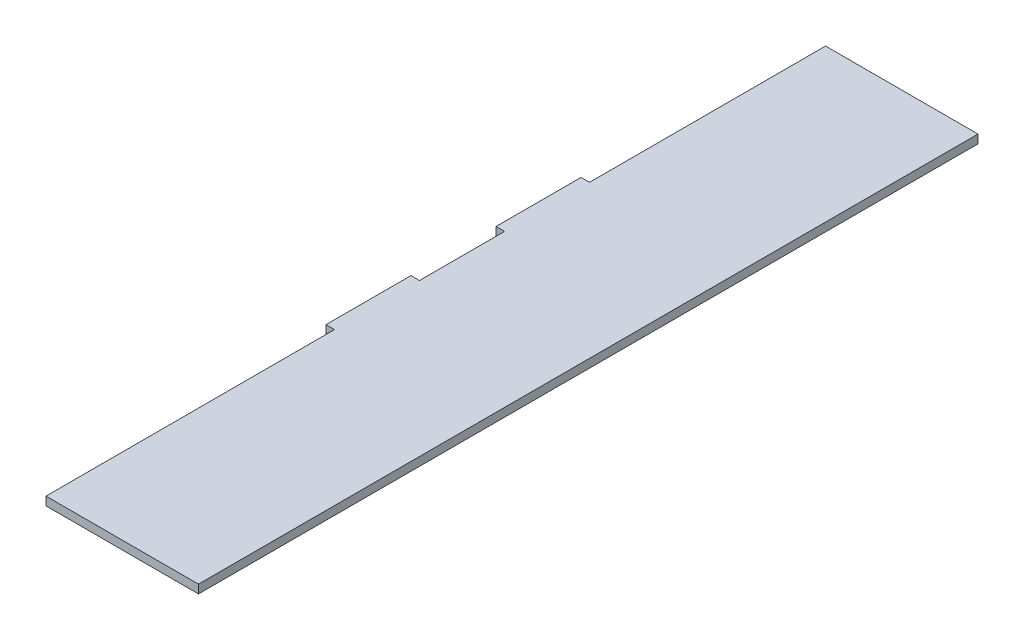
ISO-10303-21;
HEADER;
FILE_DESCRIPTION(('STEP AP214'),'2;1');
FILE_NAME('part.step','',(''),(''),'','','');
FILE_SCHEMA(('AUTOMOTIVE_DESIGN { 1 0 10303 214 1 1 1 1 }'));
ENDSEC;
DATA;
#1=APPLICATION_CONTEXT('core data for automotive mechanical design processes');
#2=APPLICATION_PROTOCOL_DEFINITION('international standard','automotive_design',2000,#1);
#3=PRODUCT_CONTEXT('',#1,'mechanical');
#4=PRODUCT('Part','Part','',(#3));
#5=PRODUCT_RELATED_PRODUCT_CATEGORY('part','',(#4));
#6=PRODUCT_DEFINITION_FORMATION('','',#4);
#7=PRODUCT_DEFINITION_CONTEXT('part definition',#1,'design');
#8=PRODUCT_DEFINITION('design','',#6,#7);
#9=PRODUCT_DEFINITION_SHAPE('','',#8);
#10=(LENGTH_UNIT() NAMED_UNIT(*) SI_UNIT(.MILLI.,.METRE.));
#11=(NAMED_UNIT(*) PLANE_ANGLE_UNIT() SI_UNIT($,.RADIAN.));
#12=(NAMED_UNIT(*) SI_UNIT($,.STERADIAN.) SOLID_ANGLE_UNIT());
#13=UNCERTAINTY_MEASURE_WITH_UNIT(LENGTH_MEASURE(1.E-05),#10,'distance_accuracy_value','');
#14=(GEOMETRIC_REPRESENTATION_CONTEXT(3) GLOBAL_UNCERTAINTY_ASSIGNED_CONTEXT((#13)) GLOBAL_UNIT_ASSIGNED_CONTEXT((#10,
#11,#12)) REPRESENTATION_CONTEXT('',''));
#15=CARTESIAN_POINT('',(0.,0.,0.));
#16=DIRECTION('',(0.,0.,1.));
#17=DIRECTION('',(1.,0.,0.));
#18=AXIS2_PLACEMENT_3D('',#15,#16,#17);
#19=CARTESIAN_POINT('',(0.,3.,0.));
#20=DIRECTION('',(1.,0.,0.));
#21=DIRECTION('',(0.,0.,-1.));
#22=AXIS2_PLACEMENT_3D('',#19,#20,#21);
#23=PLANE('',#22);
#24=DIRECTION('',(0.,0.,1.));
#25=VECTOR('',#24,1.);
#26=CARTESIAN_POINT('',(0.,3.,0.));
#27=LINE('',#26,#25);
#28=CARTESIAN_POINT('',(0.,3.,-191.8));
#29=VERTEX_POINT('',#28);
#30=CARTESIAN_POINT('',(0.,3.,-161.8));
#31=VERTEX_POINT('',#30);
#32=EDGE_CURVE('E136',#29,#31,#27,.T.);
#33=ORIENTED_EDGE('',*,*,#32,.F.);
#34=DIRECTION('',(0.,1.,0.));
#35=VECTOR('',#34,1.);
#36=CARTESIAN_POINT('',(0.,-2.,-191.8));
#37=LINE('',#36,#35);
#38=CARTESIAN_POINT('',(0.,0.,-191.8));
#39=VERTEX_POINT('',#38);
#40=EDGE_CURVE('E119',#39,#29,#37,.T.);
#41=ORIENTED_EDGE('',*,*,#40,.F.);
#42=DIRECTION('',(0.,0.,1.));
#43=VECTOR('',#42,1.);
#44=CARTESIAN_POINT('',(0.,0.,0.));
#45=LINE('',#44,#43);
#46=CARTESIAN_POINT('',(0.,0.,-161.8));
#47=VERTEX_POINT('',#46);
#48=EDGE_CURVE('E159',#39,#47,#45,.T.);
#49=ORIENTED_EDGE('',*,*,#48,.T.);
#50=DIRECTION('',(0.,1.,0.));
#51=VECTOR('',#50,1.);
#52=CARTESIAN_POINT('',(0.,-2.,-161.8));
#53=LINE('',#52,#51);
#54=EDGE_CURVE('E140',#47,#31,#53,.T.);
#55=ORIENTED_EDGE('',*,*,#54,.T.);
#56=EDGE_LOOP('',(#33,#41,#49,#55));
#57=FACE_BOUND('',#56,.T.);
#58=ADVANCED_FACE('F33',(#57),#23,.F.);
#59=CARTESIAN_POINT('',(0.,0.,-131.8));
#60=VERTEX_POINT('',#59);
#61=CARTESIAN_POINT('',(0.,0.,-101.8));
#62=VERTEX_POINT('',#61);
#63=EDGE_CURVE('E156',#60,#62,#45,.T.);
#64=ORIENTED_EDGE('',*,*,#63,.T.);
#65=DIRECTION('',(0.,1.,0.));
#66=VECTOR('',#65,1.);
#67=CARTESIAN_POINT('',(0.,-2.,-101.8));
#68=LINE('',#67,#66);
#69=CARTESIAN_POINT('',(0.,3.,-101.8));
#70=VERTEX_POINT('',#69);
#71=EDGE_CURVE('E137',#62,#70,#68,.T.);
#72=ORIENTED_EDGE('',*,*,#71,.T.);
#73=CARTESIAN_POINT('',(0.,3.,-131.8));
#74=VERTEX_POINT('',#73);
#75=EDGE_CURVE('E142',#74,#70,#27,.T.);
#76=ORIENTED_EDGE('',*,*,#75,.F.);
#77=DIRECTION('',(0.,1.,0.));
#78=VECTOR('',#77,1.);
#79=CARTESIAN_POINT('',(0.,-2.,-131.8));
#80=LINE('',#79,#78);
#81=EDGE_CURVE('E149',#60,#74,#80,.T.);
#82=ORIENTED_EDGE('',*,*,#81,.F.);
#83=EDGE_LOOP('',(#64,#72,#76,#82));
#84=FACE_BOUND('',#83,.T.);
#85=ADVANCED_FACE('F35',(#84),#23,.F.);
#86=CARTESIAN_POINT('',(0.,3.,0.));
#87=DIRECTION('',(0.,0.,-1.));
#88=DIRECTION('',(-1.,0.,0.));
#89=AXIS2_PLACEMENT_3D('',#86,#87,#88);
#90=PLANE('',#89);
#91=DIRECTION('',(1.,0.,0.));
#92=VECTOR('',#91,1.);
#93=CARTESIAN_POINT('',(0.,3.,0.));
#94=LINE('',#93,#92);
#95=CARTESIAN_POINT('',(3.,3.,0.));
#96=VERTEX_POINT('',#95);
#97=CARTESIAN_POINT('',(56.8,3.,0.));
#98=VERTEX_POINT('',#97);
#99=EDGE_CURVE('E141',#96,#98,#94,.T.);
#100=ORIENTED_EDGE('',*,*,#99,.F.);
#101=DIRECTION('',(0.,1.,0.));
#102=VECTOR('',#101,1.);
#103=CARTESIAN_POINT('',(3.,-2.,0.));
#104=LINE('',#103,#102);
#105=CARTESIAN_POINT('',(3.,0.,0.));
#106=VERTEX_POINT('',#105);
#107=EDGE_CURVE('E195',#106,#96,#104,.T.);
#108=ORIENTED_EDGE('',*,*,#107,.F.);
#109=DIRECTION('',(1.,0.,0.));
#110=VECTOR('',#109,1.);
#111=CARTESIAN_POINT('',(0.,0.,0.));
#112=LINE('',#111,#110);
#113=CARTESIAN_POINT('',(56.8,0.,0.));
#114=VERTEX_POINT('',#113);
#115=EDGE_CURVE('E161',#106,#114,#112,.T.);
#116=ORIENTED_EDGE('',*,*,#115,.T.);
#117=DIRECTION('',(0.,-1.,0.));
#118=VECTOR('',#117,1.);
#119=CARTESIAN_POINT('',(56.8,3.,0.));
#120=LINE('',#119,#118);
#121=EDGE_CURVE('E169',#98,#114,#120,.T.);
#122=ORIENTED_EDGE('',*,*,#121,.F.);
#123=EDGE_LOOP('',(#100,#108,#116,#122));
#124=FACE_BOUND('',#123,.T.);
#125=ADVANCED_FACE('F199',(#124),#90,.F.);
#126=CARTESIAN_POINT('',(56.8,3.,0.));
#127=DIRECTION('',(-1.,0.,0.));
#128=DIRECTION('',(0.,0.,1.));
#129=AXIS2_PLACEMENT_3D('',#126,#127,#128);
#130=PLANE('',#129);
#131=DIRECTION('',(0.,0.,-1.));
#132=VECTOR('',#131,1.);
#133=CARTESIAN_POINT('',(56.8,0.,0.));
#134=LINE('',#133,#132);
#135=CARTESIAN_POINT('',(56.8,0.,-275.1));
#136=VERTEX_POINT('',#135);
#137=EDGE_CURVE('E163',#114,#136,#134,.T.);
#138=ORIENTED_EDGE('',*,*,#137,.T.);
#139=DIRECTION('',(0.,-1.,0.));
#140=VECTOR('',#139,1.);
#141=CARTESIAN_POINT('',(56.8,3.,-275.1));
#142=LINE('',#141,#140);
#143=CARTESIAN_POINT('',(56.8,3.,-275.1));
#144=VERTEX_POINT('',#143);
#145=EDGE_CURVE('E155',#144,#136,#142,.T.);
#146=ORIENTED_EDGE('',*,*,#145,.F.);
#147=DIRECTION('',(0.,0.,-1.));
#148=VECTOR('',#147,1.);
#149=CARTESIAN_POINT('',(56.8,3.,0.));
#150=LINE('',#149,#148);
#151=EDGE_CURVE('E144',#98,#144,#150,.T.);
#152=ORIENTED_EDGE('',*,*,#151,.F.);
#153=ORIENTED_EDGE('',*,*,#121,.T.);
#154=EDGE_LOOP('',(#138,#146,#152,#153));
#155=FACE_BOUND('',#154,.T.);
#156=ADVANCED_FACE('F243',(#155),#130,.F.);
#157=CARTESIAN_POINT('',(0.,3.,-275.1));
#158=DIRECTION('',(0.,0.,1.));
#159=DIRECTION('',(1.,0.,0.));
#160=AXIS2_PLACEMENT_3D('',#157,#158,#159);
#161=PLANE('',#160);
#162=DIRECTION('',(-1.,0.,0.));
#163=VECTOR('',#162,1.);
#164=CARTESIAN_POINT('',(0.,0.,-275.1));
#165=LINE('',#164,#163);
#166=CARTESIAN_POINT('',(3.,0.,-275.1));
#167=VERTEX_POINT('',#166);
#168=EDGE_CURVE('E147',#136,#167,#165,.T.);
#169=ORIENTED_EDGE('',*,*,#168,.T.);
#170=DIRECTION('',(0.,1.,0.));
#171=VECTOR('',#170,1.);
#172=CARTESIAN_POINT('',(3.,-2.,-275.1));
#173=LINE('',#172,#171);
#174=CARTESIAN_POINT('',(3.,3.,-275.1));
#175=VERTEX_POINT('',#174);
#176=EDGE_CURVE('E160',#167,#175,#173,.T.);
#177=ORIENTED_EDGE('',*,*,#176,.T.);
#178=DIRECTION('',(-1.,0.,0.));
#179=VECTOR('',#178,1.);
#180=CARTESIAN_POINT('',(0.,3.,-275.1));
#181=LINE('',#180,#179);
#182=EDGE_CURVE('E153',#144,#175,#181,.T.);
#183=ORIENTED_EDGE('',*,*,#182,.F.);
#184=ORIENTED_EDGE('',*,*,#145,.T.);
#185=EDGE_LOOP('',(#169,#177,#183,#184));
#186=FACE_BOUND('',#185,.T.);
#187=ADVANCED_FACE('F238',(#186),#161,.F.);
#188=CARTESIAN_POINT('',(0.,3.,0.));
#189=DIRECTION('',(0.,-1.,0.));
#190=DIRECTION('',(0.,0.,-1.));
#191=AXIS2_PLACEMENT_3D('',#188,#189,#190);
#192=PLANE('',#191);
#193=ORIENTED_EDGE('',*,*,#182,.T.);
#194=DIRECTION('',(0.,0.,-1.));
#195=VECTOR('',#194,1.);
#196=CARTESIAN_POINT('',(3.,3.,-275.1));
#197=LINE('',#196,#195);
#198=CARTESIAN_POINT('',(3.00000000000001,3.,-191.8));
#199=VERTEX_POINT('',#198);
#200=EDGE_CURVE('E129',#199,#175,#197,.T.);
#201=ORIENTED_EDGE('',*,*,#200,.F.);
#202=DIRECTION('',(1.,0.,0.));
#203=VECTOR('',#202,1.);
#204=CARTESIAN_POINT('',(0.,3.,-191.8));
#205=LINE('',#204,#203);
#206=EDGE_CURVE('E122',#29,#199,#205,.T.);
#207=ORIENTED_EDGE('',*,*,#206,.F.);
#208=ORIENTED_EDGE('',*,*,#32,.T.);
#209=DIRECTION('',(-1.,0.,0.));
#210=VECTOR('',#209,1.);
#211=CARTESIAN_POINT('',(0.,3.,-161.8));
#212=LINE('',#211,#210);
#213=CARTESIAN_POINT('',(3.00000000000001,3.,-161.8));
#214=VERTEX_POINT('',#213);
#215=EDGE_CURVE('E214',#214,#31,#212,.T.);
#216=ORIENTED_EDGE('',*,*,#215,.F.);
#217=DIRECTION('',(0.,0.,-1.));
#218=VECTOR('',#217,1.);
#219=CARTESIAN_POINT('',(3.00000000000001,3.,-161.8));
#220=LINE('',#219,#218);
#221=CARTESIAN_POINT('',(3.00000000000002,3.,-131.8));
#222=VERTEX_POINT('',#221);
#223=EDGE_CURVE('E211',#222,#214,#220,.T.);
#224=ORIENTED_EDGE('',*,*,#223,.F.);
#225=DIRECTION('',(1.,0.,0.));
#226=VECTOR('',#225,1.);
#227=CARTESIAN_POINT('',(0.,3.,-131.8));
#228=LINE('',#227,#226);
#229=EDGE_CURVE('E208',#74,#222,#228,.T.);
#230=ORIENTED_EDGE('',*,*,#229,.F.);
#231=ORIENTED_EDGE('',*,*,#75,.T.);
#232=DIRECTION('',(-1.,0.,0.));
#233=VECTOR('',#232,1.);
#234=CARTESIAN_POINT('',(0.,3.,-101.8));
#235=LINE('',#234,#233);
#236=CARTESIAN_POINT('',(3.,3.,-101.8));
#237=VERTEX_POINT('',#236);
#238=EDGE_CURVE('E201',#237,#70,#235,.T.);
#239=ORIENTED_EDGE('',*,*,#238,.F.);
#240=DIRECTION('',(0.,0.,-1.));
#241=VECTOR('',#240,1.);
#242=CARTESIAN_POINT('',(3.,3.,0.));
#243=LINE('',#242,#241);
#244=EDGE_CURVE('E204',#96,#237,#243,.T.);
#245=ORIENTED_EDGE('',*,*,#244,.F.);
#246=ORIENTED_EDGE('',*,*,#99,.T.);
#247=ORIENTED_EDGE('',*,*,#151,.T.);
#248=EDGE_LOOP('',(#193,#201,#207,#208,#216,#224,#230,#231,#239,#245,#246,#247));
#249=FACE_BOUND('',#248,.T.);
#250=ADVANCED_FACE('F134',(#249),#192,.F.);
#251=CARTESIAN_POINT('',(0.,0.,0.));
#252=DIRECTION('',(0.,-1.,0.));
#253=DIRECTION('',(0.,0.,-1.));
#254=AXIS2_PLACEMENT_3D('',#251,#252,#253);
#255=PLANE('',#254);
#256=DIRECTION('',(0.,0.,1.));
#257=VECTOR('',#256,1.);
#258=CARTESIAN_POINT('',(3.00000000000003,0.,0.));
#259=LINE('',#258,#257);
#260=CARTESIAN_POINT('',(3.00000000000001,0.,-191.8));
#261=VERTEX_POINT('',#260);
#262=EDGE_CURVE('E11',#167,#261,#259,.T.);
#263=ORIENTED_EDGE('',*,*,#262,.F.);
#264=ORIENTED_EDGE('',*,*,#168,.F.);
#265=ORIENTED_EDGE('',*,*,#137,.F.);
#266=ORIENTED_EDGE('',*,*,#115,.F.);
#267=DIRECTION('',(0.,0.,1.));
#268=VECTOR('',#267,1.);
#269=CARTESIAN_POINT('',(3.,0.,0.));
#270=LINE('',#269,#268);
#271=CARTESIAN_POINT('',(3.,0.,-101.8));
#272=VERTEX_POINT('',#271);
#273=EDGE_CURVE('E179',#272,#106,#270,.T.);
#274=ORIENTED_EDGE('',*,*,#273,.F.);
#275=DIRECTION('',(1.,0.,0.));
#276=VECTOR('',#275,1.);
#277=CARTESIAN_POINT('',(0.,0.,-101.8));
#278=LINE('',#277,#276);
#279=EDGE_CURVE('E181',#62,#272,#278,.T.);
#280=ORIENTED_EDGE('',*,*,#279,.F.);
#281=ORIENTED_EDGE('',*,*,#63,.F.);
#282=DIRECTION('',(-1.,0.,0.));
#283=VECTOR('',#282,1.);
#284=CARTESIAN_POINT('',(0.,0.,-131.8));
#285=LINE('',#284,#283);
#286=CARTESIAN_POINT('',(3.00000000000002,0.,-131.8));
#287=VERTEX_POINT('',#286);
#288=EDGE_CURVE('E172',#287,#60,#285,.T.);
#289=ORIENTED_EDGE('',*,*,#288,.F.);
#290=DIRECTION('',(0.,0.,1.));
#291=VECTOR('',#290,1.);
#292=CARTESIAN_POINT('',(3.00000000000003,0.,0.));
#293=LINE('',#292,#291);
#294=CARTESIAN_POINT('',(3.00000000000001,0.,-161.8));
#295=VERTEX_POINT('',#294);
#296=EDGE_CURVE('E174',#295,#287,#293,.T.);
#297=ORIENTED_EDGE('',*,*,#296,.F.);
#298=DIRECTION('',(1.,0.,0.));
#299=VECTOR('',#298,1.);
#300=CARTESIAN_POINT('',(0.,0.,-161.8));
#301=LINE('',#300,#299);
#302=EDGE_CURVE('E177',#47,#295,#301,.T.);
#303=ORIENTED_EDGE('',*,*,#302,.F.);
#304=ORIENTED_EDGE('',*,*,#48,.F.);
#305=DIRECTION('',(-1.,0.,0.));
#306=VECTOR('',#305,1.);
#307=CARTESIAN_POINT('',(0.,0.,-191.8));
#308=LINE('',#307,#306);
#309=EDGE_CURVE('E41',#261,#39,#308,.T.);
#310=ORIENTED_EDGE('',*,*,#309,.F.);
#311=EDGE_LOOP('',(#263,#264,#265,#266,#274,#280,#281,#289,#297,#303,#304,#310));
#312=FACE_BOUND('',#311,.T.);
#313=ADVANCED_FACE('F191',(#312),#255,.T.);
#314=CARTESIAN_POINT('',(0.,-2.,-161.8));
#315=DIRECTION('',(0.,0.,-1.));
#316=DIRECTION('',(-1.,0.,0.));
#317=AXIS2_PLACEMENT_3D('',#314,#315,#316);
#318=PLANE('',#317);
#319=ORIENTED_EDGE('',*,*,#302,.T.);
#320=DIRECTION('',(0.,1.,0.));
#321=VECTOR('',#320,1.);
#322=CARTESIAN_POINT('',(3.00000000000001,-2.,-161.8));
#323=LINE('',#322,#321);
#324=EDGE_CURVE('E217',#295,#214,#323,.T.);
#325=ORIENTED_EDGE('',*,*,#324,.T.);
#326=ORIENTED_EDGE('',*,*,#215,.T.);
#327=ORIENTED_EDGE('',*,*,#54,.F.);
#328=EDGE_LOOP('',(#319,#325,#326,#327));
#329=FACE_BOUND('',#328,.T.);
#330=ADVANCED_FACE('F248',(#329),#318,.F.);
#331=CARTESIAN_POINT('',(3.00000000000001,-2.,-161.8));
#332=DIRECTION('',(1.,0.,0.));
#333=DIRECTION('',(0.,0.,-1.));
#334=AXIS2_PLACEMENT_3D('',#331,#332,#333);
#335=PLANE('',#334);
#336=ORIENTED_EDGE('',*,*,#296,.T.);
#337=DIRECTION('',(0.,1.,0.));
#338=VECTOR('',#337,1.);
#339=CARTESIAN_POINT('',(3.00000000000002,-2.,-131.8));
#340=LINE('',#339,#338);
#341=EDGE_CURVE('E218',#287,#222,#340,.T.);
#342=ORIENTED_EDGE('',*,*,#341,.T.);
#343=ORIENTED_EDGE('',*,*,#223,.T.);
#344=ORIENTED_EDGE('',*,*,#324,.F.);
#345=EDGE_LOOP('',(#336,#342,#343,#344));
#346=FACE_BOUND('',#345,.T.);
#347=ADVANCED_FACE('F249',(#346),#335,.F.);
#348=CARTESIAN_POINT('',(0.,-2.,-131.8));
#349=DIRECTION('',(0.,0.,1.));
#350=DIRECTION('',(1.,0.,0.));
#351=AXIS2_PLACEMENT_3D('',#348,#349,#350);
#352=PLANE('',#351);
#353=ORIENTED_EDGE('',*,*,#288,.T.);
#354=ORIENTED_EDGE('',*,*,#81,.T.);
#355=ORIENTED_EDGE('',*,*,#229,.T.);
#356=ORIENTED_EDGE('',*,*,#341,.F.);
#357=EDGE_LOOP('',(#353,#354,#355,#356));
#358=FACE_BOUND('',#357,.T.);
#359=ADVANCED_FACE('F223',(#358),#352,.F.);
#360=CARTESIAN_POINT('',(0.,-2.,-101.8));
#361=DIRECTION('',(0.,0.,-1.));
#362=DIRECTION('',(-1.,0.,0.));
#363=AXIS2_PLACEMENT_3D('',#360,#361,#362);
#364=PLANE('',#363);
#365=ORIENTED_EDGE('',*,*,#279,.T.);
#366=DIRECTION('',(0.,1.,0.));
#367=VECTOR('',#366,1.);
#368=CARTESIAN_POINT('',(3.,-2.,-101.8));
#369=LINE('',#368,#367);
#370=EDGE_CURVE('E55',#272,#237,#369,.T.);
#371=ORIENTED_EDGE('',*,*,#370,.T.);
#372=ORIENTED_EDGE('',*,*,#238,.T.);
#373=ORIENTED_EDGE('',*,*,#71,.F.);
#374=EDGE_LOOP('',(#365,#371,#372,#373));
#375=FACE_BOUND('',#374,.T.);
#376=ADVANCED_FACE('F185',(#375),#364,.F.);
#377=CARTESIAN_POINT('',(3.,-2.,0.));
#378=DIRECTION('',(1.,0.,0.));
#379=DIRECTION('',(0.,0.,-1.));
#380=AXIS2_PLACEMENT_3D('',#377,#378,#379);
#381=PLANE('',#380);
#382=ORIENTED_EDGE('',*,*,#273,.T.);
#383=ORIENTED_EDGE('',*,*,#107,.T.);
#384=ORIENTED_EDGE('',*,*,#244,.T.);
#385=ORIENTED_EDGE('',*,*,#370,.F.);
#386=EDGE_LOOP('',(#382,#383,#384,#385));
#387=FACE_BOUND('',#386,.T.);
#388=ADVANCED_FACE('F194',(#387),#381,.F.);
#389=CARTESIAN_POINT('',(3.,-2.,-275.1));
#390=DIRECTION('',(1.,0.,0.));
#391=DIRECTION('',(0.,0.,-1.));
#392=AXIS2_PLACEMENT_3D('',#389,#390,#391);
#393=PLANE('',#392);
#394=ORIENTED_EDGE('',*,*,#262,.T.);
#395=DIRECTION('',(0.,1.,0.));
#396=VECTOR('',#395,1.);
#397=CARTESIAN_POINT('',(3.00000000000001,-2.,-191.8));
#398=LINE('',#397,#396);
#399=EDGE_CURVE('E48',#261,#199,#398,.T.);
#400=ORIENTED_EDGE('',*,*,#399,.T.);
#401=ORIENTED_EDGE('',*,*,#200,.T.);
#402=ORIENTED_EDGE('',*,*,#176,.F.);
#403=EDGE_LOOP('',(#394,#400,#401,#402));
#404=FACE_BOUND('',#403,.T.);
#405=ADVANCED_FACE('F235',(#404),#393,.F.);
#406=CARTESIAN_POINT('',(0.,-2.,-191.8));
#407=DIRECTION('',(0.,0.,1.));
#408=DIRECTION('',(1.,0.,0.));
#409=AXIS2_PLACEMENT_3D('',#406,#407,#408);
#410=PLANE('',#409);
#411=ORIENTED_EDGE('',*,*,#309,.T.);
#412=ORIENTED_EDGE('',*,*,#40,.T.);
#413=ORIENTED_EDGE('',*,*,#206,.T.);
#414=ORIENTED_EDGE('',*,*,#399,.F.);
#415=EDGE_LOOP('',(#411,#412,#413,#414));
#416=FACE_BOUND('',#415,.T.);
#417=ADVANCED_FACE('F121',(#416),#410,.F.);
#418=CLOSED_SHELL('',(#58,#85,#125,#156,#187,#250,#313,#330,#347,#359,#376,#388,#405,#417));
#419=MANIFOLD_SOLID_BREP('B2',#418);
#420=ADVANCED_BREP_SHAPE_REPRESENTATION('',(#18,#419),#14);
#421=SHAPE_DEFINITION_REPRESENTATION(#9,#420);
ENDSEC;
END-ISO-10303-21;
